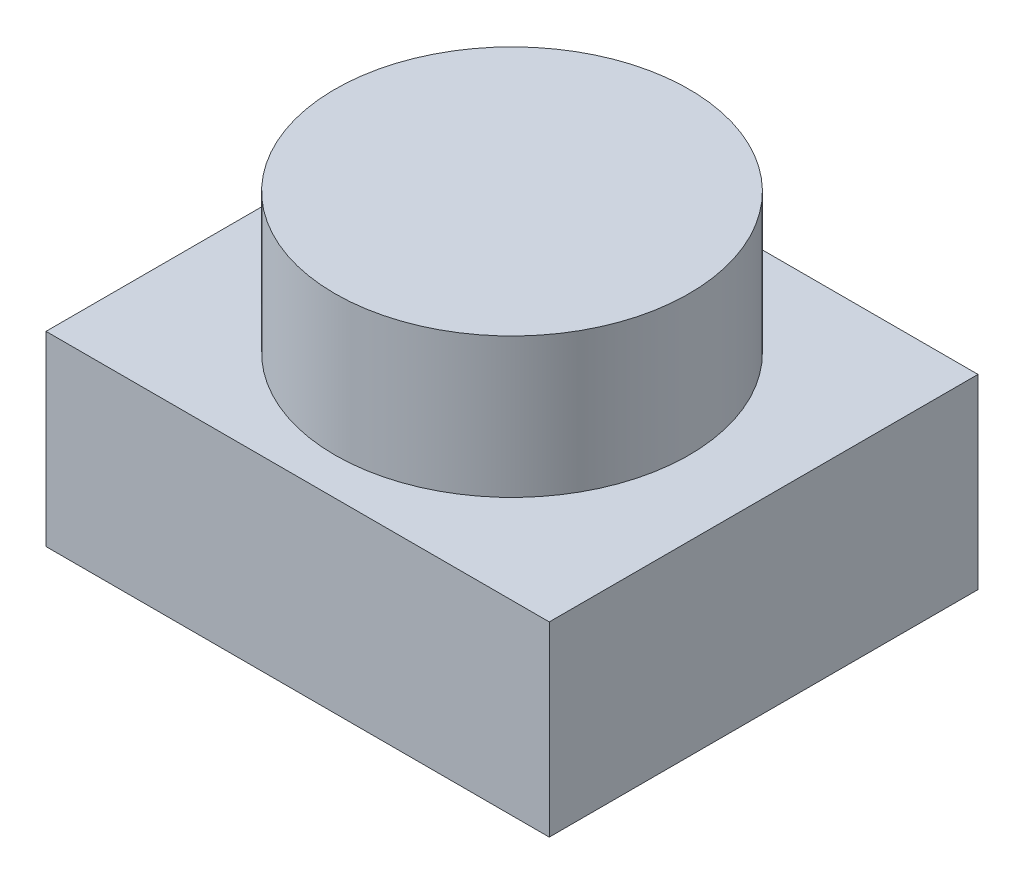
ISO-10303-21;
HEADER;
FILE_DESCRIPTION(('STEP AP214'),'2;1');
FILE_NAME('part.step','',(''),(''),'','','');
FILE_SCHEMA(('AUTOMOTIVE_DESIGN { 1 0 10303 214 1 1 1 1 }'));
ENDSEC;
DATA;
#1=APPLICATION_CONTEXT('core data for automotive mechanical design processes');
#2=APPLICATION_PROTOCOL_DEFINITION('international standard','automotive_design',2000,#1);
#3=PRODUCT_CONTEXT('',#1,'mechanical');
#4=PRODUCT('Part','Part','',(#3));
#5=PRODUCT_RELATED_PRODUCT_CATEGORY('part','',(#4));
#6=PRODUCT_DEFINITION_FORMATION('','',#4);
#7=PRODUCT_DEFINITION_CONTEXT('part definition',#1,'design');
#8=PRODUCT_DEFINITION('design','',#6,#7);
#9=PRODUCT_DEFINITION_SHAPE('','',#8);
#10=(LENGTH_UNIT() NAMED_UNIT(*) SI_UNIT(.MILLI.,.METRE.));
#11=(NAMED_UNIT(*) PLANE_ANGLE_UNIT() SI_UNIT($,.RADIAN.));
#12=(NAMED_UNIT(*) SI_UNIT($,.STERADIAN.) SOLID_ANGLE_UNIT());
#13=UNCERTAINTY_MEASURE_WITH_UNIT(LENGTH_MEASURE(1.E-05),#10,'distance_accuracy_value','');
#14=(GEOMETRIC_REPRESENTATION_CONTEXT(3) GLOBAL_UNCERTAINTY_ASSIGNED_CONTEXT((#13)) GLOBAL_UNIT_ASSIGNED_CONTEXT((#10,
#11,#12)) REPRESENTATION_CONTEXT('',''));
#15=CARTESIAN_POINT('',(0.,0.,0.));
#16=DIRECTION('',(0.,0.,1.));
#17=DIRECTION('',(1.,0.,0.));
#18=AXIS2_PLACEMENT_3D('',#15,#16,#17);
#19=CARTESIAN_POINT('',(-27.,20.,-23.));
#20=DIRECTION('',(1.,0.,0.));
#21=DIRECTION('',(0.,0.,-1.));
#22=AXIS2_PLACEMENT_3D('',#19,#20,#21);
#23=PLANE('',#22);
#24=DIRECTION('',(0.,0.,1.));
#25=VECTOR('',#24,1.);
#26=CARTESIAN_POINT('',(-27.,0.,-23.));
#27=LINE('',#26,#25);
#28=CARTESIAN_POINT('',(-27.,0.,-23.));
#29=VERTEX_POINT('',#28);
#30=CARTESIAN_POINT('',(-27.,0.,23.));
#31=VERTEX_POINT('',#30);
#32=EDGE_CURVE('E108',#29,#31,#27,.T.);
#33=ORIENTED_EDGE('',*,*,#32,.T.);
#34=DIRECTION('',(0.,-1.,0.));
#35=VECTOR('',#34,1.);
#36=CARTESIAN_POINT('',(-27.,20.,23.));
#37=LINE('',#36,#35);
#38=CARTESIAN_POINT('',(-27.,20.,23.));
#39=VERTEX_POINT('',#38);
#40=EDGE_CURVE('E46',#39,#31,#37,.T.);
#41=ORIENTED_EDGE('',*,*,#40,.F.);
#42=DIRECTION('',(0.,0.,1.));
#43=VECTOR('',#42,1.);
#44=CARTESIAN_POINT('',(-27.,20.,-23.));
#45=LINE('',#44,#43);
#46=CARTESIAN_POINT('',(-27.,20.,-23.));
#47=VERTEX_POINT('',#46);
#48=EDGE_CURVE('E96',#47,#39,#45,.T.);
#49=ORIENTED_EDGE('',*,*,#48,.F.);
#50=DIRECTION('',(0.,-1.,0.));
#51=VECTOR('',#50,1.);
#52=CARTESIAN_POINT('',(-27.,20.,-23.));
#53=LINE('',#52,#51);
#54=EDGE_CURVE('E104',#47,#29,#53,.T.);
#55=ORIENTED_EDGE('',*,*,#54,.T.);
#56=EDGE_LOOP('',(#33,#41,#49,#55));
#57=FACE_BOUND('',#56,.T.);
#58=ADVANCED_FACE('F43',(#57),#23,.F.);
#59=CARTESIAN_POINT('',(-27.,20.,23.));
#60=DIRECTION('',(0.,0.,-1.));
#61=DIRECTION('',(-1.,0.,0.));
#62=AXIS2_PLACEMENT_3D('',#59,#60,#61);
#63=PLANE('',#62);
#64=DIRECTION('',(1.,0.,0.));
#65=VECTOR('',#64,1.);
#66=CARTESIAN_POINT('',(-27.,0.,23.));
#67=LINE('',#66,#65);
#68=CARTESIAN_POINT('',(27.,0.,23.));
#69=VERTEX_POINT('',#68);
#70=EDGE_CURVE('E101',#31,#69,#67,.T.);
#71=ORIENTED_EDGE('',*,*,#70,.T.);
#72=DIRECTION('',(0.,-1.,0.));
#73=VECTOR('',#72,1.);
#74=CARTESIAN_POINT('',(27.,20.,23.));
#75=LINE('',#74,#73);
#76=CARTESIAN_POINT('',(27.,20.,23.));
#77=VERTEX_POINT('',#76);
#78=EDGE_CURVE('E97',#77,#69,#75,.T.);
#79=ORIENTED_EDGE('',*,*,#78,.F.);
#80=DIRECTION('',(1.,0.,0.));
#81=VECTOR('',#80,1.);
#82=CARTESIAN_POINT('',(-27.,20.,23.));
#83=LINE('',#82,#81);
#84=EDGE_CURVE('E93',#39,#77,#83,.T.);
#85=ORIENTED_EDGE('',*,*,#84,.F.);
#86=ORIENTED_EDGE('',*,*,#40,.T.);
#87=EDGE_LOOP('',(#71,#79,#85,#86));
#88=FACE_BOUND('',#87,.T.);
#89=ADVANCED_FACE('F99',(#88),#63,.F.);
#90=CARTESIAN_POINT('',(27.,20.,23.));
#91=DIRECTION('',(-1.,0.,0.));
#92=DIRECTION('',(0.,0.,1.));
#93=AXIS2_PLACEMENT_3D('',#90,#91,#92);
#94=PLANE('',#93);
#95=DIRECTION('',(0.,0.,-1.));
#96=VECTOR('',#95,1.);
#97=CARTESIAN_POINT('',(27.,0.,23.));
#98=LINE('',#97,#96);
#99=CARTESIAN_POINT('',(27.,0.,-23.));
#100=VERTEX_POINT('',#99);
#101=EDGE_CURVE('E80',#69,#100,#98,.T.);
#102=ORIENTED_EDGE('',*,*,#101,.T.);
#103=DIRECTION('',(0.,-1.,0.));
#104=VECTOR('',#103,1.);
#105=CARTESIAN_POINT('',(27.,20.,-23.));
#106=LINE('',#105,#104);
#107=CARTESIAN_POINT('',(27.,20.,-23.));
#108=VERTEX_POINT('',#107);
#109=EDGE_CURVE('E105',#108,#100,#106,.T.);
#110=ORIENTED_EDGE('',*,*,#109,.F.);
#111=DIRECTION('',(0.,0.,-1.));
#112=VECTOR('',#111,1.);
#113=CARTESIAN_POINT('',(27.,20.,23.));
#114=LINE('',#113,#112);
#115=EDGE_CURVE('E94',#77,#108,#114,.T.);
#116=ORIENTED_EDGE('',*,*,#115,.F.);
#117=ORIENTED_EDGE('',*,*,#78,.T.);
#118=EDGE_LOOP('',(#102,#110,#116,#117));
#119=FACE_BOUND('',#118,.T.);
#120=ADVANCED_FACE('F103',(#119),#94,.F.);
#121=CARTESIAN_POINT('',(27.,20.,-23.));
#122=DIRECTION('',(0.,0.,1.));
#123=DIRECTION('',(1.,0.,0.));
#124=AXIS2_PLACEMENT_3D('',#121,#122,#123);
#125=PLANE('',#124);
#126=DIRECTION('',(-1.,0.,0.));
#127=VECTOR('',#126,1.);
#128=CARTESIAN_POINT('',(27.,0.,-23.));
#129=LINE('',#128,#127);
#130=EDGE_CURVE('E82',#100,#29,#129,.T.);
#131=ORIENTED_EDGE('',*,*,#130,.T.);
#132=ORIENTED_EDGE('',*,*,#54,.F.);
#133=DIRECTION('',(-1.,0.,0.));
#134=VECTOR('',#133,1.);
#135=CARTESIAN_POINT('',(27.,20.,-23.));
#136=LINE('',#135,#134);
#137=EDGE_CURVE('E58',#108,#47,#136,.T.);
#138=ORIENTED_EDGE('',*,*,#137,.F.);
#139=ORIENTED_EDGE('',*,*,#109,.T.);
#140=EDGE_LOOP('',(#131,#132,#138,#139));
#141=FACE_BOUND('',#140,.T.);
#142=ADVANCED_FACE('F120',(#141),#125,.F.);
#143=CARTESIAN_POINT('',(0.,20.,0.));
#144=DIRECTION('',(0.,1.,0.));
#145=DIRECTION('',(0.,0.,1.));
#146=AXIS2_PLACEMENT_3D('',#143,#144,#145);
#147=PLANE('',#146);
#148=CARTESIAN_POINT('',(0.,20.,0.));
#149=DIRECTION('',(0.,1.,0.));
#150=DIRECTION('',(0.,0.,1.));
#151=AXIS2_PLACEMENT_3D('',#148,#149,#150);
#152=CIRCLE('',#151,19.);
#153=CARTESIAN_POINT('',(0.,20.,19.));
#154=VERTEX_POINT('',#153);
#155=EDGE_CURVE('E11',#154,#154,#152,.T.);
#156=ORIENTED_EDGE('',*,*,#155,.F.);
#157=EDGE_LOOP('',(#156));
#158=FACE_BOUND('',#157,.T.);
#159=ORIENTED_EDGE('',*,*,#48,.T.);
#160=ORIENTED_EDGE('',*,*,#84,.T.);
#161=ORIENTED_EDGE('',*,*,#115,.T.);
#162=ORIENTED_EDGE('',*,*,#137,.T.);
#163=EDGE_LOOP('',(#159,#160,#161,#162));
#164=FACE_BOUND('',#163,.T.);
#165=ADVANCED_FACE('F95',(#158,#164),#147,.T.);
#166=CARTESIAN_POINT('',(0.,0.,0.));
#167=DIRECTION('',(0.,1.,0.));
#168=DIRECTION('',(0.,0.,1.));
#169=AXIS2_PLACEMENT_3D('',#166,#167,#168);
#170=PLANE('',#169);
#171=ORIENTED_EDGE('',*,*,#32,.F.);
#172=ORIENTED_EDGE('',*,*,#130,.F.);
#173=ORIENTED_EDGE('',*,*,#101,.F.);
#174=ORIENTED_EDGE('',*,*,#70,.F.);
#175=EDGE_LOOP('',(#171,#172,#173,#174));
#176=FACE_BOUND('',#175,.T.);
#177=ADVANCED_FACE('F118',(#176),#170,.F.);
#178=CARTESIAN_POINT('',(0.,35.,0.));
#179=DIRECTION('',(0.,-1.,0.));
#180=DIRECTION('',(0.,0.,-1.));
#181=AXIS2_PLACEMENT_3D('',#178,#179,#180);
#182=CYLINDRICAL_SURFACE('',#181,19.);
#183=CARTESIAN_POINT('',(0.,35.,0.));
#184=DIRECTION('',(0.,1.,0.));
#185=DIRECTION('',(0.,0.,1.));
#186=AXIS2_PLACEMENT_3D('',#183,#184,#185);
#187=CIRCLE('',#186,19.);
#188=CARTESIAN_POINT('',(0.,35.,19.));
#189=VERTEX_POINT('',#188);
#190=EDGE_CURVE('E115',#189,#189,#187,.T.);
#191=ORIENTED_EDGE('',*,*,#190,.F.);
#192=EDGE_LOOP('',(#191));
#193=FACE_BOUND('',#192,.T.);
#194=ORIENTED_EDGE('',*,*,#155,.T.);
#195=EDGE_LOOP('',(#194));
#196=FACE_BOUND('',#195,.T.);
#197=ADVANCED_FACE('F126',(#193,#196),#182,.T.);
#198=CARTESIAN_POINT('',(0.,35.,0.));
#199=DIRECTION('',(0.,1.,0.));
#200=DIRECTION('',(0.,0.,1.));
#201=AXIS2_PLACEMENT_3D('',#198,#199,#200);
#202=PLANE('',#201);
#203=ORIENTED_EDGE('',*,*,#190,.T.);
#204=EDGE_LOOP('',(#203));
#205=FACE_BOUND('',#204,.T.);
#206=ADVANCED_FACE('F127',(#205),#202,.T.);
#207=CLOSED_SHELL('',(#58,#89,#120,#142,#165,#177,#197,#206));
#208=MANIFOLD_SOLID_BREP('B2',#207);
#209=ADVANCED_BREP_SHAPE_REPRESENTATION('',(#18,#208),#14);
#210=SHAPE_DEFINITION_REPRESENTATION(#9,#209);
ENDSEC;
END-ISO-10303-21;
